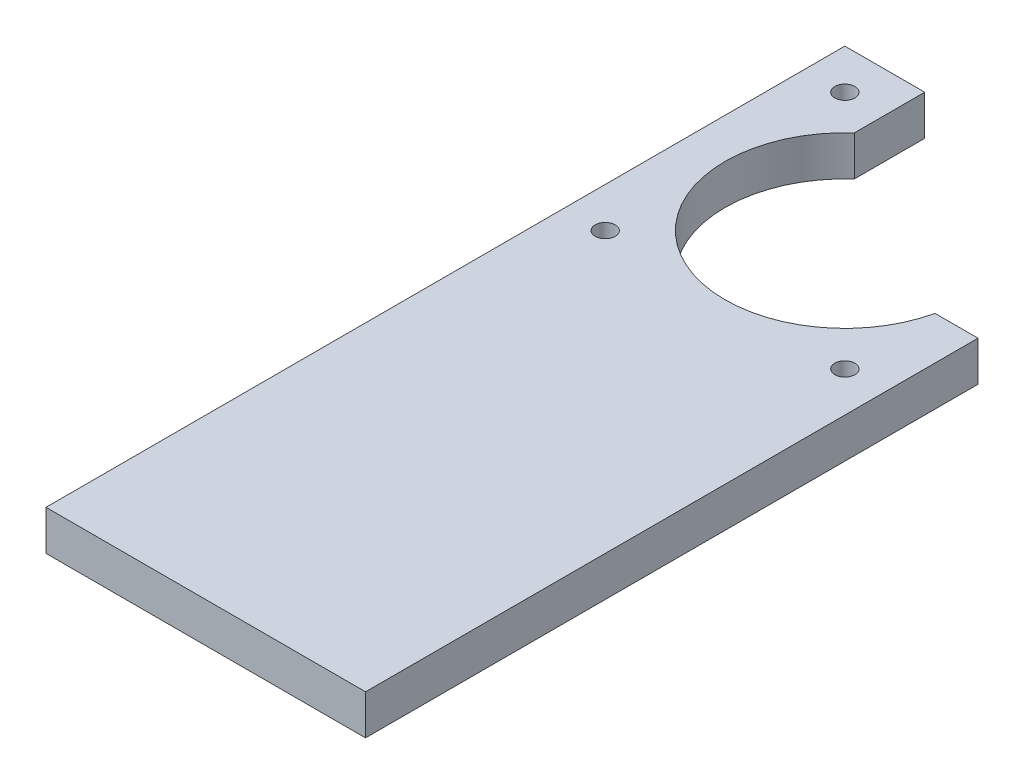
ISO-10303-21;
HEADER;
FILE_DESCRIPTION(('STEP AP214'),'2;1');
FILE_NAME('part.step','',(''),(''),'','','');
FILE_SCHEMA(('AUTOMOTIVE_DESIGN { 1 0 10303 214 1 1 1 1 }'));
ENDSEC;
DATA;
#1=APPLICATION_CONTEXT('core data for automotive mechanical design processes');
#2=APPLICATION_PROTOCOL_DEFINITION('international standard','automotive_design',2000,#1);
#3=PRODUCT_CONTEXT('',#1,'mechanical');
#4=PRODUCT('Part','Part','',(#3));
#5=PRODUCT_RELATED_PRODUCT_CATEGORY('part','',(#4));
#6=PRODUCT_DEFINITION_FORMATION('','',#4);
#7=PRODUCT_DEFINITION_CONTEXT('part definition',#1,'design');
#8=PRODUCT_DEFINITION('design','',#6,#7);
#9=PRODUCT_DEFINITION_SHAPE('','',#8);
#10=(LENGTH_UNIT() NAMED_UNIT(*) SI_UNIT(.MILLI.,.METRE.));
#11=(NAMED_UNIT(*) PLANE_ANGLE_UNIT() SI_UNIT($,.RADIAN.));
#12=(NAMED_UNIT(*) SI_UNIT($,.STERADIAN.) SOLID_ANGLE_UNIT());
#13=UNCERTAINTY_MEASURE_WITH_UNIT(LENGTH_MEASURE(1.E-05),#10,'distance_accuracy_value','');
#14=(GEOMETRIC_REPRESENTATION_CONTEXT(3) GLOBAL_UNCERTAINTY_ASSIGNED_CONTEXT((#13)) GLOBAL_UNIT_ASSIGNED_CONTEXT((#10,
#11,#12)) REPRESENTATION_CONTEXT('',''));
#15=CARTESIAN_POINT('',(0.,0.,0.));
#16=DIRECTION('',(0.,0.,1.));
#17=DIRECTION('',(1.,0.,0.));
#18=AXIS2_PLACEMENT_3D('',#15,#16,#17);
#19=CARTESIAN_POINT('',(0.,-9.525,0.));
#20=DIRECTION('',(0.,1.,0.));
#21=DIRECTION('',(0.,0.,1.));
#22=AXIS2_PLACEMENT_3D('',#19,#20,#21);
#23=CYLINDRICAL_SURFACE('',#22,28.575);
#24=CARTESIAN_POINT('',(0.,0.,0.));
#25=DIRECTION('',(0.,-1.,0.));
#26=DIRECTION('',(0.,0.,1.));
#27=AXIS2_PLACEMENT_3D('',#24,#25,#26);
#28=CIRCLE('',#27,28.575);
#29=CARTESIAN_POINT('',(27.86051192997,0.,6.35));
#30=VERTEX_POINT('',#29);
#31=CARTESIAN_POINT('',(-19.05,0.,-21.2985474856855));
#32=VERTEX_POINT('',#31);
#33=EDGE_CURVE('E84',#30,#32,#28,.T.);
#34=ORIENTED_EDGE('',*,*,#33,.F.);
#35=DIRECTION('',(0.,1.,0.));
#36=VECTOR('',#35,1.);
#37=CARTESIAN_POINT('',(27.86051192997,-9.525,6.35));
#38=LINE('',#37,#36);
#39=CARTESIAN_POINT('',(27.86051192997,-9.525,6.35));
#40=VERTEX_POINT('',#39);
#41=EDGE_CURVE('E11',#40,#30,#38,.T.);
#42=ORIENTED_EDGE('',*,*,#41,.F.);
#43=CARTESIAN_POINT('',(0.,-9.525,0.));
#44=DIRECTION('',(0.,-1.,0.));
#45=DIRECTION('',(0.,0.,1.));
#46=AXIS2_PLACEMENT_3D('',#43,#44,#45);
#47=CIRCLE('',#46,28.575);
#48=CARTESIAN_POINT('',(-19.05,-9.525,-21.2985474856855));
#49=VERTEX_POINT('',#48);
#50=EDGE_CURVE('E86',#40,#49,#47,.T.);
#51=ORIENTED_EDGE('',*,*,#50,.T.);
#52=DIRECTION('',(0.,1.,0.));
#53=VECTOR('',#52,1.);
#54=CARTESIAN_POINT('',(-19.05,-9.525,-21.2985474856855));
#55=LINE('',#54,#53);
#56=EDGE_CURVE('E29',#49,#32,#55,.T.);
#57=ORIENTED_EDGE('',*,*,#56,.T.);
#58=EDGE_LOOP('',(#34,#42,#51,#57));
#59=FACE_BOUND('',#58,.T.);
#60=ADVANCED_FACE('F26',(#59),#23,.F.);
#61=CARTESIAN_POINT('',(38.1,-9.525,6.35));
#62=DIRECTION('',(0.,0.,-1.));
#63=DIRECTION('',(-1.,0.,0.));
#64=AXIS2_PLACEMENT_3D('',#61,#62,#63);
#65=PLANE('',#64);
#66=DIRECTION('',(-1.,0.,0.));
#67=VECTOR('',#66,1.);
#68=CARTESIAN_POINT('',(38.1,0.,6.35));
#69=LINE('',#68,#67);
#70=CARTESIAN_POINT('',(38.1,0.,6.35));
#71=VERTEX_POINT('',#70);
#72=EDGE_CURVE('E102',#71,#30,#69,.T.);
#73=ORIENTED_EDGE('',*,*,#72,.F.);
#74=DIRECTION('',(0.,1.,0.));
#75=VECTOR('',#74,1.);
#76=CARTESIAN_POINT('',(38.1,-9.525,6.35));
#77=LINE('',#76,#75);
#78=CARTESIAN_POINT('',(38.1,-9.525,6.35));
#79=VERTEX_POINT('',#78);
#80=EDGE_CURVE('E34',#79,#71,#77,.T.);
#81=ORIENTED_EDGE('',*,*,#80,.F.);
#82=DIRECTION('',(-1.,0.,0.));
#83=VECTOR('',#82,1.);
#84=CARTESIAN_POINT('',(38.1,-9.525,6.35));
#85=LINE('',#84,#83);
#86=EDGE_CURVE('E91',#79,#40,#85,.T.);
#87=ORIENTED_EDGE('',*,*,#86,.T.);
#88=ORIENTED_EDGE('',*,*,#41,.T.);
#89=EDGE_LOOP('',(#73,#81,#87,#88));
#90=FACE_BOUND('',#89,.T.);
#91=ADVANCED_FACE('F159',(#90),#65,.T.);
#92=CARTESIAN_POINT('',(38.1,-9.525,6.35));
#93=DIRECTION('',(1.,0.,0.));
#94=DIRECTION('',(0.,0.,-1.));
#95=AXIS2_PLACEMENT_3D('',#92,#93,#94);
#96=PLANE('',#95);
#97=DIRECTION('',(0.,0.,-1.));
#98=VECTOR('',#97,1.);
#99=CARTESIAN_POINT('',(38.1,0.,6.35));
#100=LINE('',#99,#98);
#101=CARTESIAN_POINT('',(38.1,0.,152.4));
#102=VERTEX_POINT('',#101);
#103=EDGE_CURVE('E117',#102,#71,#100,.T.);
#104=ORIENTED_EDGE('',*,*,#103,.F.);
#105=DIRECTION('',(0.,1.,0.));
#106=VECTOR('',#105,1.);
#107=CARTESIAN_POINT('',(38.1,-9.525,152.4));
#108=LINE('',#107,#106);
#109=CARTESIAN_POINT('',(38.1,-9.525,152.4));
#110=VERTEX_POINT('',#109);
#111=EDGE_CURVE('E136',#110,#102,#108,.T.);
#112=ORIENTED_EDGE('',*,*,#111,.F.);
#113=DIRECTION('',(0.,0.,-1.));
#114=VECTOR('',#113,1.);
#115=CARTESIAN_POINT('',(38.1,-9.525,6.35));
#116=LINE('',#115,#114);
#117=EDGE_CURVE('E132',#110,#79,#116,.T.);
#118=ORIENTED_EDGE('',*,*,#117,.T.);
#119=ORIENTED_EDGE('',*,*,#80,.T.);
#120=EDGE_LOOP('',(#104,#112,#118,#119));
#121=FACE_BOUND('',#120,.T.);
#122=ADVANCED_FACE('F155',(#121),#96,.T.);
#123=CARTESIAN_POINT('',(-38.1,-9.525,152.4));
#124=DIRECTION('',(0.,0.,1.));
#125=DIRECTION('',(1.,0.,0.));
#126=AXIS2_PLACEMENT_3D('',#123,#124,#125);
#127=PLANE('',#126);
#128=DIRECTION('',(1.,0.,0.));
#129=VECTOR('',#128,1.);
#130=CARTESIAN_POINT('',(-38.1,0.,152.4));
#131=LINE('',#130,#129);
#132=CARTESIAN_POINT('',(-38.1,0.,152.4));
#133=VERTEX_POINT('',#132);
#134=EDGE_CURVE('E114',#133,#102,#131,.T.);
#135=ORIENTED_EDGE('',*,*,#134,.F.);
#136=DIRECTION('',(0.,1.,0.));
#137=VECTOR('',#136,1.);
#138=CARTESIAN_POINT('',(-38.1,-9.525,152.4));
#139=LINE('',#138,#137);
#140=CARTESIAN_POINT('',(-38.1,-9.525,152.4));
#141=VERTEX_POINT('',#140);
#142=EDGE_CURVE('E138',#141,#133,#139,.T.);
#143=ORIENTED_EDGE('',*,*,#142,.F.);
#144=DIRECTION('',(1.,0.,0.));
#145=VECTOR('',#144,1.);
#146=CARTESIAN_POINT('',(-38.1,-9.525,152.4));
#147=LINE('',#146,#145);
#148=EDGE_CURVE('E129',#141,#110,#147,.T.);
#149=ORIENTED_EDGE('',*,*,#148,.T.);
#150=ORIENTED_EDGE('',*,*,#111,.T.);
#151=EDGE_LOOP('',(#135,#143,#149,#150));
#152=FACE_BOUND('',#151,.T.);
#153=ADVANCED_FACE('F151',(#152),#127,.T.);
#154=CARTESIAN_POINT('',(-38.1,-9.525,-38.1));
#155=DIRECTION('',(-1.,0.,0.));
#156=DIRECTION('',(0.,0.,1.));
#157=AXIS2_PLACEMENT_3D('',#154,#155,#156);
#158=PLANE('',#157);
#159=DIRECTION('',(0.,0.,1.));
#160=VECTOR('',#159,1.);
#161=CARTESIAN_POINT('',(-38.1,0.,-38.1));
#162=LINE('',#161,#160);
#163=CARTESIAN_POINT('',(-38.1,0.,-38.1));
#164=VERTEX_POINT('',#163);
#165=EDGE_CURVE('E111',#164,#133,#162,.T.);
#166=ORIENTED_EDGE('',*,*,#165,.F.);
#167=DIRECTION('',(0.,1.,0.));
#168=VECTOR('',#167,1.);
#169=CARTESIAN_POINT('',(-38.1,-9.525,-38.1));
#170=LINE('',#169,#168);
#171=CARTESIAN_POINT('',(-38.1,-9.525,-38.1));
#172=VERTEX_POINT('',#171);
#173=EDGE_CURVE('E140',#172,#164,#170,.T.);
#174=ORIENTED_EDGE('',*,*,#173,.F.);
#175=DIRECTION('',(0.,0.,1.));
#176=VECTOR('',#175,1.);
#177=CARTESIAN_POINT('',(-38.1,-9.525,-38.1));
#178=LINE('',#177,#176);
#179=EDGE_CURVE('E126',#172,#141,#178,.T.);
#180=ORIENTED_EDGE('',*,*,#179,.T.);
#181=ORIENTED_EDGE('',*,*,#142,.T.);
#182=EDGE_LOOP('',(#166,#174,#180,#181));
#183=FACE_BOUND('',#182,.T.);
#184=ADVANCED_FACE('F147',(#183),#158,.T.);
#185=CARTESIAN_POINT('',(-38.1,-9.525,-38.1));
#186=DIRECTION('',(0.,0.,-1.));
#187=DIRECTION('',(-1.,0.,0.));
#188=AXIS2_PLACEMENT_3D('',#185,#186,#187);
#189=PLANE('',#188);
#190=DIRECTION('',(-1.,0.,0.));
#191=VECTOR('',#190,1.);
#192=CARTESIAN_POINT('',(-38.1,0.,-38.1));
#193=LINE('',#192,#191);
#194=CARTESIAN_POINT('',(-19.05,0.,-38.1));
#195=VERTEX_POINT('',#194);
#196=EDGE_CURVE('E98',#195,#164,#193,.T.);
#197=ORIENTED_EDGE('',*,*,#196,.F.);
#198=DIRECTION('',(0.,1.,0.));
#199=VECTOR('',#198,1.);
#200=CARTESIAN_POINT('',(-19.05,-9.525,-38.1));
#201=LINE('',#200,#199);
#202=CARTESIAN_POINT('',(-19.05,-9.525,-38.1));
#203=VERTEX_POINT('',#202);
#204=EDGE_CURVE('E90',#203,#195,#201,.T.);
#205=ORIENTED_EDGE('',*,*,#204,.F.);
#206=DIRECTION('',(-1.,0.,0.));
#207=VECTOR('',#206,1.);
#208=CARTESIAN_POINT('',(-38.1,-9.525,-38.1));
#209=LINE('',#208,#207);
#210=EDGE_CURVE('E123',#203,#172,#209,.T.);
#211=ORIENTED_EDGE('',*,*,#210,.T.);
#212=ORIENTED_EDGE('',*,*,#173,.T.);
#213=EDGE_LOOP('',(#197,#205,#211,#212));
#214=FACE_BOUND('',#213,.T.);
#215=ADVANCED_FACE('F143',(#214),#189,.T.);
#216=CARTESIAN_POINT('',(-19.05,-9.525,-38.1));
#217=DIRECTION('',(1.,0.,0.));
#218=DIRECTION('',(0.,0.,-1.));
#219=AXIS2_PLACEMENT_3D('',#216,#217,#218);
#220=PLANE('',#219);
#221=DIRECTION('',(0.,0.,-1.));
#222=VECTOR('',#221,1.);
#223=CARTESIAN_POINT('',(-19.05,0.,-38.1));
#224=LINE('',#223,#222);
#225=EDGE_CURVE('E93',#32,#195,#224,.T.);
#226=ORIENTED_EDGE('',*,*,#225,.F.);
#227=ORIENTED_EDGE('',*,*,#56,.F.);
#228=DIRECTION('',(0.,0.,-1.));
#229=VECTOR('',#228,1.);
#230=CARTESIAN_POINT('',(-19.05,-9.525,-38.1));
#231=LINE('',#230,#229);
#232=EDGE_CURVE('E121',#49,#203,#231,.T.);
#233=ORIENTED_EDGE('',*,*,#232,.T.);
#234=ORIENTED_EDGE('',*,*,#204,.T.);
#235=EDGE_LOOP('',(#226,#227,#233,#234));
#236=FACE_BOUND('',#235,.T.);
#237=ADVANCED_FACE('F94',(#236),#220,.T.);
#238=CARTESIAN_POINT('',(0.,-9.525,0.));
#239=DIRECTION('',(0.,1.,0.));
#240=DIRECTION('',(0.,0.,1.));
#241=AXIS2_PLACEMENT_3D('',#238,#239,#240);
#242=PLANE('',#241);
#243=CARTESIAN_POINT('',(-28.575,-9.525,28.575));
#244=DIRECTION('',(0.,1.,0.));
#245=DIRECTION('',(0.,0.,-1.));
#246=AXIS2_PLACEMENT_3D('',#243,#244,#245);
#247=CIRCLE('',#246,2.3876);
#248=CARTESIAN_POINT('',(-28.575,-9.525,30.9626));
#249=VERTEX_POINT('',#248);
#250=EDGE_CURVE('E188',#249,#249,#247,.T.);
#251=ORIENTED_EDGE('',*,*,#250,.T.);
#252=EDGE_LOOP('',(#251));
#253=FACE_BOUND('',#252,.T.);
#254=CARTESIAN_POINT('',(28.575,-9.525,28.575));
#255=DIRECTION('',(0.,1.,0.));
#256=DIRECTION('',(0.,0.,1.));
#257=AXIS2_PLACEMENT_3D('',#254,#255,#256);
#258=CIRCLE('',#257,2.3876);
#259=CARTESIAN_POINT('',(28.575,-9.525,30.9626));
#260=VERTEX_POINT('',#259);
#261=EDGE_CURVE('E192',#260,#260,#258,.T.);
#262=ORIENTED_EDGE('',*,*,#261,.T.);
#263=EDGE_LOOP('',(#262));
#264=FACE_BOUND('',#263,.T.);
#265=CARTESIAN_POINT('',(-28.575,-9.525,-28.575));
#266=DIRECTION('',(0.,1.,0.));
#267=DIRECTION('',(0.,0.,1.));
#268=AXIS2_PLACEMENT_3D('',#265,#266,#267);
#269=CIRCLE('',#268,2.3876);
#270=CARTESIAN_POINT('',(-28.575,-9.525,-26.1874));
#271=VERTEX_POINT('',#270);
#272=EDGE_CURVE('E103',#271,#271,#269,.T.);
#273=ORIENTED_EDGE('',*,*,#272,.T.);
#274=EDGE_LOOP('',(#273));
#275=FACE_BOUND('',#274,.T.);
#276=ORIENTED_EDGE('',*,*,#50,.F.);
#277=ORIENTED_EDGE('',*,*,#86,.F.);
#278=ORIENTED_EDGE('',*,*,#117,.F.);
#279=ORIENTED_EDGE('',*,*,#148,.F.);
#280=ORIENTED_EDGE('',*,*,#179,.F.);
#281=ORIENTED_EDGE('',*,*,#210,.F.);
#282=ORIENTED_EDGE('',*,*,#232,.F.);
#283=EDGE_LOOP('',(#276,#277,#278,#279,#280,#281,#282));
#284=FACE_BOUND('',#283,.T.);
#285=ADVANCED_FACE('F158',(#253,#264,#275,#284),#242,.F.);
#286=CARTESIAN_POINT('',(0.,0.,0.));
#287=DIRECTION('',(0.,1.,0.));
#288=DIRECTION('',(0.,0.,1.));
#289=AXIS2_PLACEMENT_3D('',#286,#287,#288);
#290=PLANE('',#289);
#291=CARTESIAN_POINT('',(-28.575,0.,28.575));
#292=DIRECTION('',(0.,1.,0.));
#293=DIRECTION('',(0.,0.,-1.));
#294=AXIS2_PLACEMENT_3D('',#291,#292,#293);
#295=CIRCLE('',#294,2.3876);
#296=CARTESIAN_POINT('',(-28.575,0.,30.9626));
#297=VERTEX_POINT('',#296);
#298=EDGE_CURVE('E208',#297,#297,#295,.T.);
#299=ORIENTED_EDGE('',*,*,#298,.F.);
#300=EDGE_LOOP('',(#299));
#301=FACE_BOUND('',#300,.T.);
#302=CARTESIAN_POINT('',(28.575,0.,28.575));
#303=DIRECTION('',(0.,1.,0.));
#304=DIRECTION('',(0.,0.,1.));
#305=AXIS2_PLACEMENT_3D('',#302,#303,#304);
#306=CIRCLE('',#305,2.3876);
#307=CARTESIAN_POINT('',(28.575,0.,30.9626));
#308=VERTEX_POINT('',#307);
#309=EDGE_CURVE('E202',#308,#308,#306,.T.);
#310=ORIENTED_EDGE('',*,*,#309,.F.);
#311=EDGE_LOOP('',(#310));
#312=FACE_BOUND('',#311,.T.);
#313=CARTESIAN_POINT('',(-28.575,0.,-28.575));
#314=DIRECTION('',(0.,1.,0.));
#315=DIRECTION('',(0.,0.,1.));
#316=AXIS2_PLACEMENT_3D('',#313,#314,#315);
#317=CIRCLE('',#316,2.3876);
#318=CARTESIAN_POINT('',(-28.575,0.,-26.1874));
#319=VERTEX_POINT('',#318);
#320=EDGE_CURVE('E106',#319,#319,#317,.T.);
#321=ORIENTED_EDGE('',*,*,#320,.F.);
#322=EDGE_LOOP('',(#321));
#323=FACE_BOUND('',#322,.T.);
#324=ORIENTED_EDGE('',*,*,#33,.T.);
#325=ORIENTED_EDGE('',*,*,#225,.T.);
#326=ORIENTED_EDGE('',*,*,#196,.T.);
#327=ORIENTED_EDGE('',*,*,#165,.T.);
#328=ORIENTED_EDGE('',*,*,#134,.T.);
#329=ORIENTED_EDGE('',*,*,#103,.T.);
#330=ORIENTED_EDGE('',*,*,#72,.T.);
#331=EDGE_LOOP('',(#324,#325,#326,#327,#328,#329,#330));
#332=FACE_BOUND('',#331,.T.);
#333=ADVANCED_FACE('F100',(#301,#312,#323,#332),#290,.T.);
#334=CARTESIAN_POINT('',(-28.575,-9.525,-28.575));
#335=DIRECTION('',(0.,1.,0.));
#336=DIRECTION('',(0.,0.,1.));
#337=AXIS2_PLACEMENT_3D('',#334,#335,#336);
#338=CYLINDRICAL_SURFACE('',#337,2.3876);
#339=CARTESIAN_POINT('',(-28.575,-9.525,-26.1874));
#340=CARTESIAN_POINT('',(-28.575,-9.42578125,-26.1874));
#341=CARTESIAN_POINT('',(-28.575,-9.3265625,-26.1874));
#342=CARTESIAN_POINT('',(-28.575,-9.128125,-26.1874));
#343=CARTESIAN_POINT('',(-28.575,-9.02890625,-26.1874));
#344=CARTESIAN_POINT('',(-28.575,-8.83046875,-26.1874));
#345=CARTESIAN_POINT('',(-28.575,-8.73125,-26.1874));
#346=CARTESIAN_POINT('',(-28.575,-8.5328125,-26.1874));
#347=CARTESIAN_POINT('',(-28.575,-8.43359375,-26.1874));
#348=CARTESIAN_POINT('',(-28.575,-8.23515625,-26.1874));
#349=CARTESIAN_POINT('',(-28.575,-8.1359375,-26.1874));
#350=CARTESIAN_POINT('',(-28.575,-7.9375,-26.1874));
#351=CARTESIAN_POINT('',(-28.575,-7.83828125,-26.1874));
#352=CARTESIAN_POINT('',(-28.575,-7.63984375,-26.1874));
#353=CARTESIAN_POINT('',(-28.575,-7.540625,-26.1874));
#354=CARTESIAN_POINT('',(-28.575,-7.3421875,-26.1874));
#355=CARTESIAN_POINT('',(-28.575,-7.24296875,-26.1874));
#356=CARTESIAN_POINT('',(-28.575,-7.04453125,-26.1874));
#357=CARTESIAN_POINT('',(-28.575,-6.9453125,-26.1874));
#358=CARTESIAN_POINT('',(-28.575,-6.746875,-26.1874));
#359=CARTESIAN_POINT('',(-28.575,-6.64765625,-26.1874));
#360=CARTESIAN_POINT('',(-28.575,-6.44921875,-26.1874));
#361=CARTESIAN_POINT('',(-28.575,-6.35,-26.1874));
#362=CARTESIAN_POINT('',(-28.575,-6.1515625,-26.1874));
#363=CARTESIAN_POINT('',(-28.575,-6.05234375,-26.1874));
#364=CARTESIAN_POINT('',(-28.575,-5.85390625,-26.1874));
#365=CARTESIAN_POINT('',(-28.575,-5.7546875,-26.1874));
#366=CARTESIAN_POINT('',(-28.575,-5.55625,-26.1874));
#367=CARTESIAN_POINT('',(-28.575,-5.45703125,-26.1874));
#368=CARTESIAN_POINT('',(-28.575,-5.25859375,-26.1874));
#369=CARTESIAN_POINT('',(-28.575,-5.159375,-26.1874));
#370=CARTESIAN_POINT('',(-28.575,-4.9609375,-26.1874));
#371=CARTESIAN_POINT('',(-28.575,-4.86171875,-26.1874));
#372=CARTESIAN_POINT('',(-28.575,-4.66328125,-26.1874));
#373=CARTESIAN_POINT('',(-28.575,-4.5640625,-26.1874));
#374=CARTESIAN_POINT('',(-28.575,-4.365625,-26.1874));
#375=CARTESIAN_POINT('',(-28.575,-4.26640625,-26.1874));
#376=CARTESIAN_POINT('',(-28.575,-4.06796875,-26.1874));
#377=CARTESIAN_POINT('',(-28.575,-3.96875,-26.1874));
#378=CARTESIAN_POINT('',(-28.575,-3.7703125,-26.1874));
#379=CARTESIAN_POINT('',(-28.575,-3.67109375,-26.1874));
#380=CARTESIAN_POINT('',(-28.575,-3.47265625,-26.1874));
#381=CARTESIAN_POINT('',(-28.575,-3.3734375,-26.1874));
#382=CARTESIAN_POINT('',(-28.575,-3.175,-26.1874));
#383=CARTESIAN_POINT('',(-28.575,-3.07578125,-26.1874));
#384=CARTESIAN_POINT('',(-28.575,-2.87734375,-26.1874));
#385=CARTESIAN_POINT('',(-28.575,-2.778125,-26.1874));
#386=CARTESIAN_POINT('',(-28.575,-2.5796875,-26.1874));
#387=CARTESIAN_POINT('',(-28.575,-2.48046875,-26.1874));
#388=CARTESIAN_POINT('',(-28.575,-2.28203125,-26.1874));
#389=CARTESIAN_POINT('',(-28.575,-2.1828125,-26.1874));
#390=CARTESIAN_POINT('',(-28.575,-1.984375,-26.1874));
#391=CARTESIAN_POINT('',(-28.575,-1.88515625,-26.1874));
#392=CARTESIAN_POINT('',(-28.575,-1.68671875,-26.1874));
#393=CARTESIAN_POINT('',(-28.575,-1.5875,-26.1874));
#394=CARTESIAN_POINT('',(-28.575,-1.3890625,-26.1874));
#395=CARTESIAN_POINT('',(-28.575,-1.28984375,-26.1874));
#396=CARTESIAN_POINT('',(-28.575,-1.09140625,-26.1874));
#397=CARTESIAN_POINT('',(-28.575,-0.992187500000001,-26.1874));
#398=CARTESIAN_POINT('',(-28.575,-0.793750000000001,-26.1874));
#399=CARTESIAN_POINT('',(-28.575,-0.69453125,-26.1874));
#400=CARTESIAN_POINT('',(-28.575,-0.49609375,-26.1874));
#401=CARTESIAN_POINT('',(-28.575,-0.396875,-26.1874));
#402=CARTESIAN_POINT('',(-28.575,-0.1984375,-26.1874));
#403=CARTESIAN_POINT('',(-28.575,-0.0992187500000001,-26.1874));
#404=CARTESIAN_POINT('',(-28.575,0.,-26.1874));
#405=B_SPLINE_CURVE_WITH_KNOTS('',3,(#339,#340,#341,#342,#343,#344,#345,#346,#347,#348,#349,
#350,#351,#352,#353,#354,#355,#356,#357,#358,#359,#360,#361,#362,#363,#364,#365,#366,#367,#368,
#369,#370,#371,#372,#373,#374,#375,#376,#377,#378,#379,#380,#381,#382,#383,#384,#385,#386,#387,
#388,#389,#390,#391,#392,#393,#394,#395,#396,#397,#398,#399,#400,#401,#402,#403,#404),
.UNSPECIFIED.,.F.,.F.,(4,2,2,2,2,2,2,2,2,2,2,2,2,2,2,2,2,2,2,2,2,2,2,2,2,2,2,2,2,2,2,2,4),(0.,
0.297656249999998,0.595312499999999,0.892968749999999,1.190625,1.48828125,1.7859375,2.08359375,
2.38125,2.67890625,2.9765625,3.27421875,3.571875,3.86953125,4.1671875,4.46484375,4.7625,
5.06015625,5.3578125,5.65546875,5.953125,6.25078125,6.5484375,6.84609375,7.14375,7.44140625,
7.7390625,8.03671875,8.334375,8.63203125,8.9296875,9.22734375,9.525),.UNSPECIFIED.);
#406=EDGE_CURVE('BSEAM183',#271,#319,#405,.T.);
#407=ORIENTED_EDGE('',*,*,#272,.F.);
#408=ORIENTED_EDGE('',*,*,#320,.T.);
#409=ORIENTED_EDGE('',*,*,#406,.T.);
#410=ORIENTED_EDGE('',*,*,#406,.F.);
#411=EDGE_LOOP('',(#407,#409,#408,#410));
#412=FACE_BOUND('',#411,.T.);
#413=ADVANCED_FACE('F183',(#412),#338,.F.);
#414=CARTESIAN_POINT('',(28.575,-9.525,28.575));
#415=DIRECTION('',(0.,1.,0.));
#416=DIRECTION('',(0.,0.,1.));
#417=AXIS2_PLACEMENT_3D('',#414,#415,#416);
#418=CYLINDRICAL_SURFACE('',#417,2.3876);
#419=CARTESIAN_POINT('',(28.575,-9.525,30.9626));
#420=CARTESIAN_POINT('',(28.575,-9.42578125,30.9626));
#421=CARTESIAN_POINT('',(28.575,-9.3265625,30.9626));
#422=CARTESIAN_POINT('',(28.575,-9.128125,30.9626));
#423=CARTESIAN_POINT('',(28.575,-9.02890625,30.9626));
#424=CARTESIAN_POINT('',(28.575,-8.83046875,30.9626));
#425=CARTESIAN_POINT('',(28.575,-8.73125,30.9626));
#426=CARTESIAN_POINT('',(28.575,-8.5328125,30.9626));
#427=CARTESIAN_POINT('',(28.575,-8.43359375,30.9626));
#428=CARTESIAN_POINT('',(28.575,-8.23515625,30.9626));
#429=CARTESIAN_POINT('',(28.575,-8.1359375,30.9626));
#430=CARTESIAN_POINT('',(28.575,-7.9375,30.9626));
#431=CARTESIAN_POINT('',(28.575,-7.83828125,30.9626));
#432=CARTESIAN_POINT('',(28.575,-7.63984375,30.9626));
#433=CARTESIAN_POINT('',(28.575,-7.540625,30.9626));
#434=CARTESIAN_POINT('',(28.575,-7.3421875,30.9626));
#435=CARTESIAN_POINT('',(28.575,-7.24296875,30.9626));
#436=CARTESIAN_POINT('',(28.575,-7.04453125,30.9626));
#437=CARTESIAN_POINT('',(28.575,-6.9453125,30.9626));
#438=CARTESIAN_POINT('',(28.575,-6.746875,30.9626));
#439=CARTESIAN_POINT('',(28.575,-6.64765625,30.9626));
#440=CARTESIAN_POINT('',(28.575,-6.44921875,30.9626));
#441=CARTESIAN_POINT('',(28.575,-6.35,30.9626));
#442=CARTESIAN_POINT('',(28.575,-6.1515625,30.9626));
#443=CARTESIAN_POINT('',(28.575,-6.05234375,30.9626));
#444=CARTESIAN_POINT('',(28.575,-5.85390625,30.9626));
#445=CARTESIAN_POINT('',(28.575,-5.7546875,30.9626));
#446=CARTESIAN_POINT('',(28.575,-5.55625,30.9626));
#447=CARTESIAN_POINT('',(28.575,-5.45703125,30.9626));
#448=CARTESIAN_POINT('',(28.575,-5.25859375,30.9626));
#449=CARTESIAN_POINT('',(28.575,-5.159375,30.9626));
#450=CARTESIAN_POINT('',(28.575,-4.9609375,30.9626));
#451=CARTESIAN_POINT('',(28.575,-4.86171875,30.9626));
#452=CARTESIAN_POINT('',(28.575,-4.66328125,30.9626));
#453=CARTESIAN_POINT('',(28.575,-4.5640625,30.9626));
#454=CARTESIAN_POINT('',(28.575,-4.365625,30.9626));
#455=CARTESIAN_POINT('',(28.575,-4.26640625,30.9626));
#456=CARTESIAN_POINT('',(28.575,-4.06796875,30.9626));
#457=CARTESIAN_POINT('',(28.575,-3.96875,30.9626));
#458=CARTESIAN_POINT('',(28.575,-3.7703125,30.9626));
#459=CARTESIAN_POINT('',(28.575,-3.67109375,30.9626));
#460=CARTESIAN_POINT('',(28.575,-3.47265625,30.9626));
#461=CARTESIAN_POINT('',(28.575,-3.3734375,30.9626));
#462=CARTESIAN_POINT('',(28.575,-3.175,30.9626));
#463=CARTESIAN_POINT('',(28.575,-3.07578125,30.9626));
#464=CARTESIAN_POINT('',(28.575,-2.87734375,30.9626));
#465=CARTESIAN_POINT('',(28.575,-2.778125,30.9626));
#466=CARTESIAN_POINT('',(28.575,-2.5796875,30.9626));
#467=CARTESIAN_POINT('',(28.575,-2.48046875,30.9626));
#468=CARTESIAN_POINT('',(28.575,-2.28203125,30.9626));
#469=CARTESIAN_POINT('',(28.575,-2.1828125,30.9626));
#470=CARTESIAN_POINT('',(28.575,-1.984375,30.9626));
#471=CARTESIAN_POINT('',(28.575,-1.88515625,30.9626));
#472=CARTESIAN_POINT('',(28.575,-1.68671875,30.9626));
#473=CARTESIAN_POINT('',(28.575,-1.5875,30.9626));
#474=CARTESIAN_POINT('',(28.575,-1.3890625,30.9626));
#475=CARTESIAN_POINT('',(28.575,-1.28984375,30.9626));
#476=CARTESIAN_POINT('',(28.575,-1.09140625,30.9626));
#477=CARTESIAN_POINT('',(28.575,-0.992187500000001,30.9626));
#478=CARTESIAN_POINT('',(28.575,-0.793750000000001,30.9626));
#479=CARTESIAN_POINT('',(28.575,-0.69453125,30.9626));
#480=CARTESIAN_POINT('',(28.575,-0.49609375,30.9626));
#481=CARTESIAN_POINT('',(28.575,-0.396875,30.9626));
#482=CARTESIAN_POINT('',(28.575,-0.1984375,30.9626));
#483=CARTESIAN_POINT('',(28.575,-0.0992187500000001,30.9626));
#484=CARTESIAN_POINT('',(28.575,0.,30.9626));
#485=B_SPLINE_CURVE_WITH_KNOTS('',3,(#419,#420,#421,#422,#423,#424,#425,#426,#427,#428,#429,
#430,#431,#432,#433,#434,#435,#436,#437,#438,#439,#440,#441,#442,#443,#444,#445,#446,#447,#448,
#449,#450,#451,#452,#453,#454,#455,#456,#457,#458,#459,#460,#461,#462,#463,#464,#465,#466,#467,
#468,#469,#470,#471,#472,#473,#474,#475,#476,#477,#478,#479,#480,#481,#482,#483,#484),
.UNSPECIFIED.,.F.,.F.,(4,2,2,2,2,2,2,2,2,2,2,2,2,2,2,2,2,2,2,2,2,2,2,2,2,2,2,2,2,2,2,2,4),(0.,
0.297656249999998,0.595312499999999,0.892968749999999,1.190625,1.48828125,1.7859375,2.08359375,
2.38125,2.67890625,2.9765625,3.27421875,3.571875,3.86953125,4.1671875,4.46484375,4.7625,
5.06015625,5.3578125,5.65546875,5.953125,6.25078125,6.5484375,6.84609375,7.14375,7.44140625,
7.7390625,8.03671875,8.334375,8.63203125,8.9296875,9.22734375,9.525),.UNSPECIFIED.);
#486=EDGE_CURVE('BSEAM197',#260,#308,#485,.T.);
#487=ORIENTED_EDGE('',*,*,#261,.F.);
#488=ORIENTED_EDGE('',*,*,#309,.T.);
#489=ORIENTED_EDGE('',*,*,#486,.T.);
#490=ORIENTED_EDGE('',*,*,#486,.F.);
#491=EDGE_LOOP('',(#487,#489,#488,#490));
#492=FACE_BOUND('',#491,.T.);
#493=ADVANCED_FACE('F197',(#492),#418,.F.);
#494=CARTESIAN_POINT('',(-28.575,-9.525,28.575));
#495=DIRECTION('',(0.,1.,0.));
#496=DIRECTION('',(0.,0.,1.));
#497=AXIS2_PLACEMENT_3D('',#494,#495,#496);
#498=CYLINDRICAL_SURFACE('',#497,2.3876);
#499=CARTESIAN_POINT('',(-28.575,-9.525,30.9626));
#500=CARTESIAN_POINT('',(-28.575,-9.42578125,30.9626));
#501=CARTESIAN_POINT('',(-28.575,-9.3265625,30.9626));
#502=CARTESIAN_POINT('',(-28.575,-9.128125,30.9626));
#503=CARTESIAN_POINT('',(-28.575,-9.02890625,30.9626));
#504=CARTESIAN_POINT('',(-28.575,-8.83046875,30.9626));
#505=CARTESIAN_POINT('',(-28.575,-8.73125,30.9626));
#506=CARTESIAN_POINT('',(-28.575,-8.5328125,30.9626));
#507=CARTESIAN_POINT('',(-28.575,-8.43359375,30.9626));
#508=CARTESIAN_POINT('',(-28.575,-8.23515625,30.9626));
#509=CARTESIAN_POINT('',(-28.575,-8.1359375,30.9626));
#510=CARTESIAN_POINT('',(-28.575,-7.9375,30.9626));
#511=CARTESIAN_POINT('',(-28.575,-7.83828125,30.9626));
#512=CARTESIAN_POINT('',(-28.575,-7.63984375,30.9626));
#513=CARTESIAN_POINT('',(-28.575,-7.540625,30.9626));
#514=CARTESIAN_POINT('',(-28.575,-7.3421875,30.9626));
#515=CARTESIAN_POINT('',(-28.575,-7.24296875,30.9626));
#516=CARTESIAN_POINT('',(-28.575,-7.04453125,30.9626));
#517=CARTESIAN_POINT('',(-28.575,-6.9453125,30.9626));
#518=CARTESIAN_POINT('',(-28.575,-6.746875,30.9626));
#519=CARTESIAN_POINT('',(-28.575,-6.64765625,30.9626));
#520=CARTESIAN_POINT('',(-28.575,-6.44921875,30.9626));
#521=CARTESIAN_POINT('',(-28.575,-6.35,30.9626));
#522=CARTESIAN_POINT('',(-28.575,-6.1515625,30.9626));
#523=CARTESIAN_POINT('',(-28.575,-6.05234375,30.9626));
#524=CARTESIAN_POINT('',(-28.575,-5.85390625,30.9626));
#525=CARTESIAN_POINT('',(-28.575,-5.7546875,30.9626));
#526=CARTESIAN_POINT('',(-28.575,-5.55625,30.9626));
#527=CARTESIAN_POINT('',(-28.575,-5.45703125,30.9626));
#528=CARTESIAN_POINT('',(-28.575,-5.25859375,30.9626));
#529=CARTESIAN_POINT('',(-28.575,-5.159375,30.9626));
#530=CARTESIAN_POINT('',(-28.575,-4.9609375,30.9626));
#531=CARTESIAN_POINT('',(-28.575,-4.86171875,30.9626));
#532=CARTESIAN_POINT('',(-28.575,-4.66328125,30.9626));
#533=CARTESIAN_POINT('',(-28.575,-4.5640625,30.9626));
#534=CARTESIAN_POINT('',(-28.575,-4.365625,30.9626));
#535=CARTESIAN_POINT('',(-28.575,-4.26640625,30.9626));
#536=CARTESIAN_POINT('',(-28.575,-4.06796875,30.9626));
#537=CARTESIAN_POINT('',(-28.575,-3.96875,30.9626));
#538=CARTESIAN_POINT('',(-28.575,-3.7703125,30.9626));
#539=CARTESIAN_POINT('',(-28.575,-3.67109375,30.9626));
#540=CARTESIAN_POINT('',(-28.575,-3.47265625,30.9626));
#541=CARTESIAN_POINT('',(-28.575,-3.3734375,30.9626));
#542=CARTESIAN_POINT('',(-28.575,-3.175,30.9626));
#543=CARTESIAN_POINT('',(-28.575,-3.07578125,30.9626));
#544=CARTESIAN_POINT('',(-28.575,-2.87734375,30.9626));
#545=CARTESIAN_POINT('',(-28.575,-2.778125,30.9626));
#546=CARTESIAN_POINT('',(-28.575,-2.5796875,30.9626));
#547=CARTESIAN_POINT('',(-28.575,-2.48046875,30.9626));
#548=CARTESIAN_POINT('',(-28.575,-2.28203125,30.9626));
#549=CARTESIAN_POINT('',(-28.575,-2.1828125,30.9626));
#550=CARTESIAN_POINT('',(-28.575,-1.984375,30.9626));
#551=CARTESIAN_POINT('',(-28.575,-1.88515625,30.9626));
#552=CARTESIAN_POINT('',(-28.575,-1.68671875,30.9626));
#553=CARTESIAN_POINT('',(-28.575,-1.5875,30.9626));
#554=CARTESIAN_POINT('',(-28.575,-1.3890625,30.9626));
#555=CARTESIAN_POINT('',(-28.575,-1.28984375,30.9626));
#556=CARTESIAN_POINT('',(-28.575,-1.09140625,30.9626));
#557=CARTESIAN_POINT('',(-28.575,-0.992187500000001,30.9626));
#558=CARTESIAN_POINT('',(-28.575,-0.793750000000001,30.9626));
#559=CARTESIAN_POINT('',(-28.575,-0.69453125,30.9626));
#560=CARTESIAN_POINT('',(-28.575,-0.49609375,30.9626));
#561=CARTESIAN_POINT('',(-28.575,-0.396875,30.9626));
#562=CARTESIAN_POINT('',(-28.575,-0.1984375,30.9626));
#563=CARTESIAN_POINT('',(-28.575,-0.0992187500000001,30.9626));
#564=CARTESIAN_POINT('',(-28.575,0.,30.9626));
#565=B_SPLINE_CURVE_WITH_KNOTS('',3,(#499,#500,#501,#502,#503,#504,#505,#506,#507,#508,#509,
#510,#511,#512,#513,#514,#515,#516,#517,#518,#519,#520,#521,#522,#523,#524,#525,#526,#527,#528,
#529,#530,#531,#532,#533,#534,#535,#536,#537,#538,#539,#540,#541,#542,#543,#544,#545,#546,#547,
#548,#549,#550,#551,#552,#553,#554,#555,#556,#557,#558,#559,#560,#561,#562,#563,#564),
.UNSPECIFIED.,.F.,.F.,(4,2,2,2,2,2,2,2,2,2,2,2,2,2,2,2,2,2,2,2,2,2,2,2,2,2,2,2,2,2,2,2,4),(0.,
0.297656249999998,0.595312499999999,0.892968749999999,1.190625,1.48828125,1.7859375,2.08359375,
2.38125,2.67890625,2.9765625,3.27421875,3.571875,3.86953125,4.1671875,4.46484375,4.7625,
5.06015625,5.3578125,5.65546875,5.953125,6.25078125,6.5484375,6.84609375,7.14375,7.44140625,
7.7390625,8.03671875,8.334375,8.63203125,8.9296875,9.22734375,9.525),.UNSPECIFIED.);
#566=EDGE_CURVE('BSEAM212',#249,#297,#565,.T.);
#567=ORIENTED_EDGE('',*,*,#250,.F.);
#568=ORIENTED_EDGE('',*,*,#298,.T.);
#569=ORIENTED_EDGE('',*,*,#566,.T.);
#570=ORIENTED_EDGE('',*,*,#566,.F.);
#571=EDGE_LOOP('',(#567,#569,#568,#570));
#572=FACE_BOUND('',#571,.T.);
#573=ADVANCED_FACE('F212',(#572),#498,.F.);
#574=CLOSED_SHELL('',(#60,#91,#122,#153,#184,#215,#237,#285,#333,#413,#493,#573));
#575=MANIFOLD_SOLID_BREP('B2',#574);
#576=ADVANCED_BREP_SHAPE_REPRESENTATION('',(#18,#575),#14);
#577=SHAPE_DEFINITION_REPRESENTATION(#9,#576);
ENDSEC;
END-ISO-10303-21;
